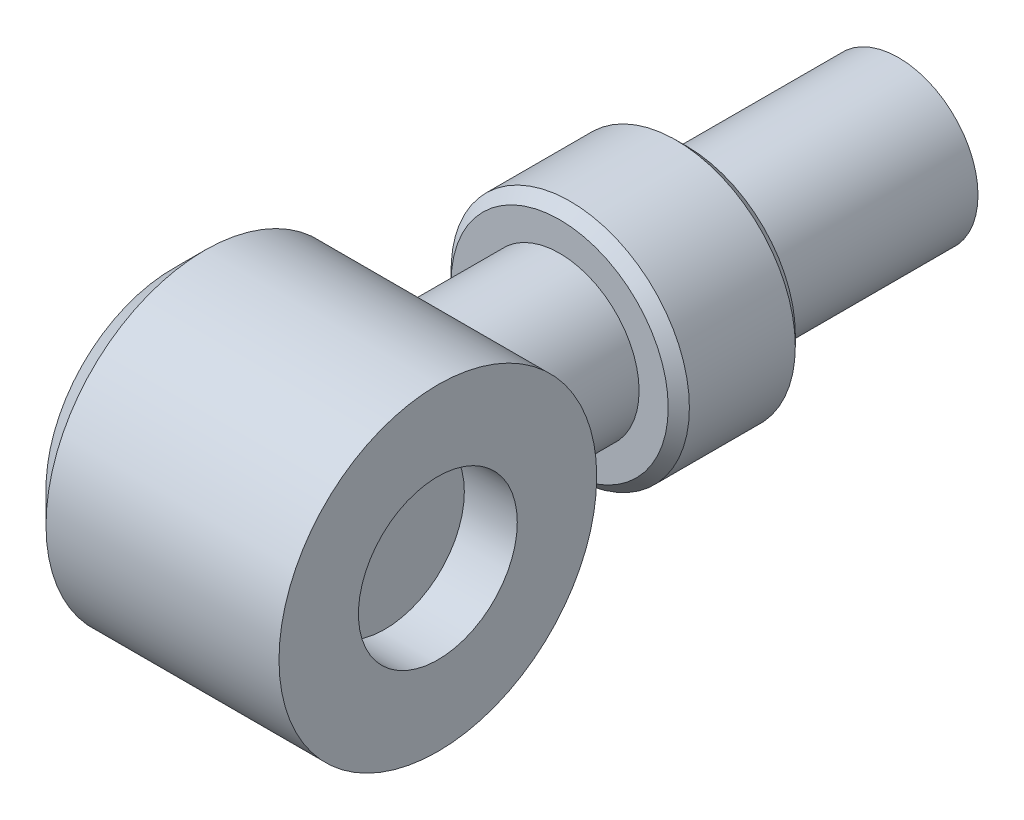
ISO-10303-21;
HEADER;
FILE_DESCRIPTION(('STEP AP214'),'2;1');
FILE_NAME('part.step','',(''),(''),'','','');
FILE_SCHEMA(('AUTOMOTIVE_DESIGN { 1 0 10303 214 1 1 1 1 }'));
ENDSEC;
DATA;
#1=APPLICATION_CONTEXT('core data for automotive mechanical design processes');
#2=APPLICATION_PROTOCOL_DEFINITION('international standard','automotive_design',2000,#1);
#3=PRODUCT_CONTEXT('',#1,'mechanical');
#4=PRODUCT('Part','Part','',(#3));
#5=PRODUCT_RELATED_PRODUCT_CATEGORY('part','',(#4));
#6=PRODUCT_DEFINITION_FORMATION('','',#4);
#7=PRODUCT_DEFINITION_CONTEXT('part definition',#1,'design');
#8=PRODUCT_DEFINITION('design','',#6,#7);
#9=PRODUCT_DEFINITION_SHAPE('','',#8);
#10=(LENGTH_UNIT() NAMED_UNIT(*) SI_UNIT(.MILLI.,.METRE.));
#11=(NAMED_UNIT(*) PLANE_ANGLE_UNIT() SI_UNIT($,.RADIAN.));
#12=(NAMED_UNIT(*) SI_UNIT($,.STERADIAN.) SOLID_ANGLE_UNIT());
#13=UNCERTAINTY_MEASURE_WITH_UNIT(LENGTH_MEASURE(1.E-05),#10,'distance_accuracy_value','');
#14=(GEOMETRIC_REPRESENTATION_CONTEXT(3) GLOBAL_UNCERTAINTY_ASSIGNED_CONTEXT((#13)) GLOBAL_UNIT_ASSIGNED_CONTEXT((#10,
#11,#12)) REPRESENTATION_CONTEXT('',''));
#15=CARTESIAN_POINT('',(0.,0.,0.));
#16=DIRECTION('',(0.,0.,1.));
#17=DIRECTION('',(1.,0.,0.));
#18=AXIS2_PLACEMENT_3D('',#15,#16,#17);
#19=CARTESIAN_POINT('',(0.,0.,12.));
#20=DIRECTION('',(0.,0.,-1.));
#21=DIRECTION('',(-1.,0.,0.));
#22=AXIS2_PLACEMENT_3D('',#19,#20,#21);
#23=CYLINDRICAL_SURFACE('',#22,22.5);
#24=CARTESIAN_POINT('',(0.,0.,-10.));
#25=DIRECTION('',(0.,0.,1.));
#26=DIRECTION('',(1.,0.,0.));
#27=AXIS2_PLACEMENT_3D('',#24,#25,#26);
#28=CIRCLE('',#27,22.5);
#29=CARTESIAN_POINT('',(22.5,0.,-10.));
#30=VERTEX_POINT('',#29);
#31=EDGE_CURVE('E43',#30,#30,#28,.T.);
#32=ORIENTED_EDGE('',*,*,#31,.T.);
#33=EDGE_LOOP('',(#32));
#34=FACE_BOUND('',#33,.T.);
#35=CARTESIAN_POINT('',(0.,0.,10.));
#36=DIRECTION('',(0.,0.,1.));
#37=DIRECTION('',(1.,0.,0.));
#38=AXIS2_PLACEMENT_3D('',#35,#36,#37);
#39=CIRCLE('',#38,22.5);
#40=CARTESIAN_POINT('',(22.5,0.,10.));
#41=VERTEX_POINT('',#40);
#42=EDGE_CURVE('E47',#41,#41,#39,.F.);
#43=ORIENTED_EDGE('',*,*,#42,.T.);
#44=EDGE_LOOP('',(#43));
#45=FACE_BOUND('',#44,.T.);
#46=ADVANCED_FACE('F32',(#34,#45),#23,.T.);
#47=CARTESIAN_POINT('',(0.,0.,12.));
#48=DIRECTION('',(0.,0.,1.));
#49=DIRECTION('',(1.,0.,0.));
#50=AXIS2_PLACEMENT_3D('',#47,#48,#49);
#51=PLANE('',#50);
#52=CARTESIAN_POINT('',(0.,0.,12.));
#53=DIRECTION('',(0.,0.,1.));
#54=DIRECTION('',(1.,0.,0.));
#55=AXIS2_PLACEMENT_3D('',#52,#53,#54);
#56=CIRCLE('',#55,20.5);
#57=CARTESIAN_POINT('',(20.5,0.,12.));
#58=VERTEX_POINT('',#57);
#59=EDGE_CURVE('E10',#58,#58,#56,.T.);
#60=ORIENTED_EDGE('',*,*,#59,.T.);
#61=EDGE_LOOP('',(#60));
#62=FACE_BOUND('',#61,.T.);
#63=CARTESIAN_POINT('',(0.,0.,12.));
#64=DIRECTION('',(0.,0.,1.));
#65=DIRECTION('',(1.,0.,0.));
#66=AXIS2_PLACEMENT_3D('',#63,#64,#65);
#67=CIRCLE('',#66,15.);
#68=CARTESIAN_POINT('',(15.,0.,12.));
#69=VERTEX_POINT('',#68);
#70=EDGE_CURVE('E72',#69,#69,#67,.T.);
#71=ORIENTED_EDGE('',*,*,#70,.F.);
#72=EDGE_LOOP('',(#71));
#73=FACE_BOUND('',#72,.T.);
#74=ADVANCED_FACE('F88',(#62,#73),#51,.T.);
#75=CARTESIAN_POINT('',(0.,0.,-12.));
#76=DIRECTION('',(0.,0.,1.));
#77=DIRECTION('',(1.,0.,0.));
#78=AXIS2_PLACEMENT_3D('',#75,#76,#77);
#79=PLANE('',#78);
#80=CARTESIAN_POINT('',(0.,0.,-12.));
#81=DIRECTION('',(0.,0.,1.));
#82=DIRECTION('',(1.,0.,0.));
#83=AXIS2_PLACEMENT_3D('',#80,#81,#82);
#84=CIRCLE('',#83,20.5);
#85=CARTESIAN_POINT('',(20.5,0.,-12.));
#86=VERTEX_POINT('',#85);
#87=EDGE_CURVE('E39',#86,#86,#84,.F.);
#88=ORIENTED_EDGE('',*,*,#87,.T.);
#89=EDGE_LOOP('',(#88));
#90=FACE_BOUND('',#89,.T.);
#91=CARTESIAN_POINT('',(0.,0.,-12.));
#92=DIRECTION('',(0.,0.,1.));
#93=DIRECTION('',(1.,0.,0.));
#94=AXIS2_PLACEMENT_3D('',#91,#92,#93);
#95=CIRCLE('',#94,15.);
#96=CARTESIAN_POINT('',(15.,0.,-12.));
#97=VERTEX_POINT('',#96);
#98=EDGE_CURVE('E58',#97,#97,#95,.F.);
#99=ORIENTED_EDGE('',*,*,#98,.F.);
#100=EDGE_LOOP('',(#99));
#101=FACE_BOUND('',#100,.T.);
#102=ADVANCED_FACE('F86',(#90,#101),#79,.F.);
#103=CARTESIAN_POINT('',(0.,0.,-52.));
#104=DIRECTION('',(0.,0.,1.));
#105=DIRECTION('',(1.,0.,0.));
#106=AXIS2_PLACEMENT_3D('',#103,#104,#105);
#107=CYLINDRICAL_SURFACE('',#106,15.);
#108=CARTESIAN_POINT('',(0.,0.,-52.));
#109=DIRECTION('',(0.,0.,-1.));
#110=DIRECTION('',(-1.,0.,0.));
#111=AXIS2_PLACEMENT_3D('',#108,#109,#110);
#112=CIRCLE('',#111,15.);
#113=CARTESIAN_POINT('',(-15.,0.,-52.));
#114=VERTEX_POINT('',#113);
#115=EDGE_CURVE('E61',#114,#114,#112,.T.);
#116=ORIENTED_EDGE('',*,*,#115,.F.);
#117=EDGE_LOOP('',(#116));
#118=FACE_BOUND('',#117,.T.);
#119=ORIENTED_EDGE('',*,*,#98,.T.);
#120=EDGE_LOOP('',(#119));
#121=FACE_BOUND('',#120,.T.);
#122=ADVANCED_FACE('F82',(#118,#121),#107,.T.);
#123=CARTESIAN_POINT('',(0.,0.,-52.));
#124=DIRECTION('',(0.,0.,-1.));
#125=DIRECTION('',(-1.,0.,0.));
#126=AXIS2_PLACEMENT_3D('',#123,#124,#125);
#127=PLANE('',#126);
#128=ORIENTED_EDGE('',*,*,#115,.T.);
#129=EDGE_LOOP('',(#128));
#130=FACE_BOUND('',#129,.T.);
#131=ADVANCED_FACE('F79',(#130),#127,.T.);
#132=CARTESIAN_POINT('',(0.,0.,500000.));
#133=DIRECTION('',(0.,0.,-1.));
#134=DIRECTION('',(-1.,0.,0.));
#135=AXIS2_PLACEMENT_3D('',#132,#133,#134);
#136=CYLINDRICAL_SURFACE('',#135,15.);
#137=ORIENTED_EDGE('',*,*,#70,.T.);
#138=EDGE_LOOP('',(#137));
#139=FACE_BOUND('',#138,.T.);
#140=CARTESIAN_POINT('',(-15.,0.,30.0000000000023));
#141=CARTESIAN_POINT('',(-14.9999986967893,-0.394466621474841,30.0000011984455));
#142=CARTESIAN_POINT('',(-14.9844217290986,-0.788960822893733,30.0077983744419));
#143=CARTESIAN_POINT('',(-14.9222912626951,-1.57504384672509,30.0387906968739));
#144=CARTESIAN_POINT('',(-14.8757242881962,-1.96663133023585,30.0619925419109));
#145=CARTESIAN_POINT('',(-14.752062134402,-2.74444839066614,30.1232456655127));
#146=CARTESIAN_POINT('',(-14.6749156717779,-3.13066783309061,30.1613218875906));
#147=CARTESIAN_POINT('',(-14.4909926788045,-3.89427274204158,30.2513454827882));
#148=CARTESIAN_POINT('',(-14.3842191117728,-4.27165908796747,30.3032914686275));
#149=CARTESIAN_POINT('',(-14.1426464967422,-5.01370255233923,30.4195454648338));
#150=CARTESIAN_POINT('',(-14.0079586988167,-5.37840368544467,30.4838043286831));
#151=CARTESIAN_POINT('',(-13.7115835174738,-6.09447648128189,30.6233011875056));
#152=CARTESIAN_POINT('',(-13.5498955527414,-6.44584785682347,30.6985394188606));
#153=CARTESIAN_POINT('',(-13.2009461452605,-7.13327098283047,30.8582613908768));
#154=CARTESIAN_POINT('',(-13.0136941461367,-7.46932832959938,30.9427417151322));
#155=CARTESIAN_POINT('',(-12.6148696065897,-8.12479620523728,31.1191595930147));
#156=CARTESIAN_POINT('',(-12.4032874777651,-8.44420009848118,31.2111000824307));
#157=CARTESIAN_POINT('',(-11.9437431549206,-9.08356730455522,31.4061694854223));
#158=CARTESIAN_POINT('',(-11.6943566948692,-9.40240338911212,31.5096387559583));
#159=CARTESIAN_POINT('',(-11.1713323045256,-10.0182110858625,31.7203010589421));
#160=CARTESIAN_POINT('',(-10.8976929878611,-10.3151814463613,31.8274943040511));
#161=CARTESIAN_POINT('',(-10.3274421322098,-10.8860835918353,32.0431340534047));
#162=CARTESIAN_POINT('',(-10.0308163772595,-11.1600008976789,32.1515812973432));
#163=CARTESIAN_POINT('',(-9.41609706949237,-11.6833254232376,32.3670484725743));
#164=CARTESIAN_POINT('',(-9.09799950074778,-11.9327280363633,32.4740681323546));
#165=CARTESIAN_POINT('',(-8.41621019135638,-12.4240666663251,32.6921196878575));
#166=CARTESIAN_POINT('',(-8.05089693128145,-12.6639084928375,32.8028149530864));
#167=CARTESIAN_POINT('',(-7.29906225682766,-13.1116371457318,33.0158114298701));
#168=CARTESIAN_POINT('',(-6.91254992484969,-13.319537514021,33.1181161900414));
#169=CARTESIAN_POINT('',(-6.1204511952892,-13.7015816677249,33.3108177560533));
#170=CARTESIAN_POINT('',(-5.71487061752177,-13.8757356708104,33.4012181636103));
#171=CARTESIAN_POINT('',(-4.88717106989463,-14.1884178363296,33.5666850653911));
#172=CARTESIAN_POINT('',(-4.46505393858188,-14.3269499463524,33.6417532585286));
#173=CARTESIAN_POINT('',(-3.63312743966071,-14.5593818816457,33.7694656361183));
#174=CARTESIAN_POINT('',(-3.22409061692188,-14.6554546162324,33.8231819916719));
#175=CARTESIAN_POINT('',(-2.39742530260402,-14.8131483158836,33.9120933725818));
#176=CARTESIAN_POINT('',(-1.9797971793402,-14.874770754679,33.9472891902146));
#177=CARTESIAN_POINT('',(-1.13997809784112,-14.9625716596024,33.9976150205557));
#178=CARTESIAN_POINT('',(-0.717791304375684,-14.9887801055065,34.0127620054154));
#179=CARTESIAN_POINT('',(0.127503752153367,-15.0054120092055,34.0223610149371));
#180=CARTESIAN_POINT('',(0.550611923450999,-14.9958388811994,34.0168150140783));
#181=CARTESIAN_POINT('',(1.34318604493272,-14.9443693637688,33.9871854699879));
#182=CARTESIAN_POINT('',(1.71300749674357,-14.9064815133301,33.9654016426218));
#183=CARTESIAN_POINT('',(2.44761394651902,-14.8036048078167,33.9067672995302));
#184=CARTESIAN_POINT('',(2.81239941379478,-14.7386184959445,33.8699181976935));
#185=CARTESIAN_POINT('',(3.53465011425951,-14.5822778462236,33.7823498774175));
#186=CARTESIAN_POINT('',(3.89211348946956,-14.4909169024539,33.7316271842972));
#187=CARTESIAN_POINT('',(4.59755097022426,-14.2827793732035,33.6178799154345));
#188=CARTESIAN_POINT('',(4.94552456919422,-14.1660014339124,33.5548546844284));
#189=CARTESIAN_POINT('',(5.63806138553543,-13.9051185945144,33.4167356572684));
#190=CARTESIAN_POINT('',(5.98236177926333,-13.7604466030274,33.3413974796238));
#191=CARTESIAN_POINT('',(6.6576488128704,-13.4467240006948,33.1817863498032));
#192=CARTESIAN_POINT('',(6.98863063670941,-13.2776646708394,33.097510204973));
#193=CARTESIAN_POINT('',(7.6358395411983,-12.916320746071,32.9221681212191));
#194=CARTESIAN_POINT('',(7.95206429387378,-12.7240325037788,32.8311011168632));
#195=CARTESIAN_POINT('',(8.5685227561537,-12.3173373374605,32.6443191371437));
#196=CARTESIAN_POINT('',(8.8687551800777,-12.1029286391492,32.5486037892621));
#197=CARTESIAN_POINT('',(9.48921356105565,-11.6244221009994,32.3422881545745));
#198=CARTESIAN_POINT('',(9.80713018813423,-11.3574724540829,32.2313422891799));
#199=CARTESIAN_POINT('',(10.4195910602955,-10.7983337273757,32.0091719486512));
#200=CARTESIAN_POINT('',(10.7141433900477,-10.5061534517947,31.8979475837492));
#201=CARTESIAN_POINT('',(11.2787205781468,-9.89761910582885,31.6778903447877));
#202=CARTESIAN_POINT('',(11.5487236024524,-9.58124396820893,31.5690596636207));
#203=CARTESIAN_POINT('',(12.0621805278787,-8.92619254193703,31.3566484542524));
#204=CARTESIAN_POINT('',(12.3056450163624,-8.58752523371352,31.2530658412628));
#205=CARTESIAN_POINT('',(12.7751937974682,-7.8730915238493,31.0490279507982));
#206=CARTESIAN_POINT('',(12.9999312688771,-7.49633062281147,30.9489459616295));
#207=CARTESIAN_POINT('',(13.4165538554256,-6.72229496746207,30.7601397693207));
#208=CARTESIAN_POINT('',(13.6084374406831,-6.32501925897356,30.6714160951431));
#209=CARTESIAN_POINT('',(13.95719145457,-5.51289034160726,30.507976152198));
#210=CARTESIAN_POINT('',(14.1140841452216,-5.09804850978503,30.4332509821276));
#211=CARTESIAN_POINT('',(14.3910761684711,-4.25373396764085,30.3000284698657));
#212=CARTESIAN_POINT('',(14.5111797336915,-3.82426294674293,30.2415292609357));
#213=CARTESIAN_POINT('',(14.7045987917793,-2.99040123124769,30.1467130246424));
#214=CARTESIAN_POINT('',(14.7809658647281,-2.58687987737163,30.1089599379182));
#215=CARTESIAN_POINT('',(14.9004227368483,-1.77375891598874,30.0497096179865));
#216=CARTESIAN_POINT('',(14.9435143460633,-1.36415964033046,30.0282115005791));
#217=CARTESIAN_POINT('',(14.9958394822899,-0.542432179601423,30.002088586177));
#218=CARTESIAN_POINT('',(15.0050865466642,-0.130305071716841,29.9974570427833));
#219=CARTESIAN_POINT('',(14.9896332143828,0.693142933067965,30.005182902425));
#220=CARTESIAN_POINT('',(14.9649343201033,1.10446386484103,30.0175395535989));
#221=CARTESIAN_POINT('',(14.8851569218173,1.89104365716484,30.0572742996872));
#222=CARTESIAN_POINT('',(14.8325856924446,2.26662317638432,30.0834117840358));
#223=CARTESIAN_POINT('',(14.6994449555598,3.01155508954012,30.1491988284816));
#224=CARTESIAN_POINT('',(14.618877249521,3.38090788254105,30.1888475191776));
#225=CARTESIAN_POINT('',(14.4305792041858,4.11102643115725,30.2807323556061));
#226=CARTESIAN_POINT('',(14.322847354219,4.47179170797634,30.3329692013922));
#227=CARTESIAN_POINT('',(14.0812572947495,5.18257720416908,30.4488481102626));
#228=CARTESIAN_POINT('',(13.9473979874992,5.53259697135373,30.5124906525492));
#229=CARTESIAN_POINT('',(13.6505393721981,6.22979935488028,30.6517537822062));
#230=CARTESIAN_POINT('',(13.4868176517072,6.57661612017314,30.727664302393));
#231=CARTESIAN_POINT('',(13.1343016754681,7.2550868034974,30.8883996001503));
#232=CARTESIAN_POINT('',(12.9455071994248,7.58674058826894,30.9732244560427));
#233=CARTESIAN_POINT('',(12.5441531585985,8.23341158684502,31.1499858507572));
#234=CARTESIAN_POINT('',(12.3315897999931,8.54842613296254,31.2419235241537));
#235=CARTESIAN_POINT('',(11.8839483671782,9.16054648853298,31.4310122851658));
#236=CARTESIAN_POINT('',(11.6488615394066,9.45764526147828,31.5281653932149));
#237=CARTESIAN_POINT('',(11.1333715012892,10.0608391073351,31.7353414642011));
#238=CARTESIAN_POINT('',(10.8507851186194,10.3649587307602,31.8456921439829));
#239=CARTESIAN_POINT('',(10.2616154855623,10.9485707923033,32.0674692994105));
#240=CARTESIAN_POINT('',(9.95503116977244,11.2280621358617,32.1788958226263));
#241=CARTESIAN_POINT('',(9.31919419442981,11.7611578740021,32.4000272898316));
#242=CARTESIAN_POINT('',(8.9899279270946,12.0147464980316,32.5097311510101));
#243=CARTESIAN_POINT('',(8.31037887445751,12.4944228999318,32.7243979489938));
#244=CARTESIAN_POINT('',(7.96009249191935,12.7205059505333,32.8293600689122));
#245=CARTESIAN_POINT('',(7.22261605950768,13.153917206094,33.0364145372086));
#246=CARTESIAN_POINT('',(6.83445930863611,13.3597919511092,33.1381169374886));
#247=CARTESIAN_POINT('',(6.0392785059831,13.7375672329611,33.3293403874839));
#248=CARTESIAN_POINT('',(5.63226376216383,13.909484314717,33.4188673626777));
#249=CARTESIAN_POINT('',(4.80217565091463,14.2174151642658,33.5822880682726));
#250=CARTESIAN_POINT('',(4.37911544662168,14.353457663537,33.656194299646));
#251=CARTESIAN_POINT('',(3.51992505793503,14.5879514095296,33.7853159874805));
#252=CARTESIAN_POINT('',(3.08379690851359,14.6864084766722,33.8405343377673));
#253=CARTESIAN_POINT('',(2.24471283239224,14.8366134509912,33.9254608695714));
#254=CARTESIAN_POINT('',(1.84259137531843,14.8919378625023,33.9571090305878));
#255=CARTESIAN_POINT('',(1.03415900372192,14.9698153891526,34.0017947783997));
#256=CARTESIAN_POINT('',(0.627848376009248,14.9923707330054,34.0148336308638));
#257=CARTESIAN_POINT('',(-0.185270351508141,15.0043645010929,34.0217573653192));
#258=CARTESIAN_POINT('',(-0.592078211651319,14.9938151743778,34.0156493318453));
#259=CARTESIAN_POINT('',(-1.40275816467987,14.939788481599,33.9845490123115));
#260=CARTESIAN_POINT('',(-1.80663037706597,14.8963124635393,33.9595574993326));
#261=CARTESIAN_POINT('',(-2.56967168244075,14.782795841076,33.8949672789861));
#262=CARTESIAN_POINT('',(-2.92942204471833,14.7156934571527,33.8569941501007));
#263=CARTESIAN_POINT('',(-3.64159381579544,14.5558242789107,33.7676466677042));
#264=CARTESIAN_POINT('',(-3.99401275857409,14.4630489945772,33.7162678812707));
#265=CARTESIAN_POINT('',(-4.68939648000375,14.2527724980854,33.6016517113839));
#266=CARTESIAN_POINT('',(-5.03236114606193,14.1352709916015,33.5384141867725));
#267=CARTESIAN_POINT('',(-5.70716431681714,13.8765585244576,33.4018326364665));
#268=CARTESIAN_POINT('',(-6.03900172289264,13.7353452308955,33.3284876164657));
#269=CARTESIAN_POINT('',(-6.71194905721821,13.4200195538921,33.1683695444201));
#270=CARTESIAN_POINT('',(-7.052186337383,13.2443351386714,33.0810256229154));
#271=CARTESIAN_POINT('',(-7.71683729888781,12.8684192321827,32.8993107427324));
#272=CARTESIAN_POINT('',(-8.04125049766923,12.6681869929772,32.804939569978));
#273=CARTESIAN_POINT('',(-8.67307599887733,12.2442855818537,32.6114666475547));
#274=CARTESIAN_POINT('',(-8.98048183592655,12.0206075892617,32.5123631251881));
#275=CARTESIAN_POINT('',(-9.57700095794109,11.5509819278366,32.3117348192738));
#276=CARTESIAN_POINT('',(-9.86611149224969,11.3050309237572,32.2102096747853));
#277=CARTESIAN_POINT('',(-10.4588881043878,10.7607009160987,31.9945880165764));
#278=CARTESIAN_POINT('',(-10.7600384098887,10.4595848725633,31.8804663758213));
#279=CARTESIAN_POINT('',(-11.3360350079753,9.83237263592971,31.6550628439847));
#280=CARTESIAN_POINT('',(-11.6108894699082,9.50628425805786,31.5437800788784));
#281=CARTESIAN_POINT('',(-12.1328673274453,8.83040064495077,31.3268405545289));
#282=CARTESIAN_POINT('',(-12.37996865132,8.48058689086171,31.2211883077679));
#283=CARTESIAN_POINT('',(-12.8443186951048,7.75934315416588,31.0184042132714));
#284=CARTESIAN_POINT('',(-13.0615691351247,7.38791441884522,30.9212718747065));
#285=CARTESIAN_POINT('',(-13.4657554418475,6.62283359834567,30.737499586337));
#286=CARTESIAN_POINT('',(-13.6524633074691,6.22904153096534,30.650939674485));
#287=CARTESIAN_POINT('',(-13.9917304392216,5.42422205013347,30.4915931025656));
#288=CARTESIAN_POINT('',(-14.1442848128174,5.01319217734285,30.418808416049));
#289=CARTESIAN_POINT('',(-14.4130312534336,4.17809175418113,30.2893683631609));
#290=CARTESIAN_POINT('',(-14.52931393542,3.75405665560539,30.2326728349316));
#291=CARTESIAN_POINT('',(-14.7244141315277,2.89570983328129,30.136960690795));
#292=CARTESIAN_POINT('',(-14.8032545313493,2.46140455781236,30.0979332763591));
#293=CARTESIAN_POINT('',(-14.9084233559045,1.68912528485795,30.0457085005696));
#294=CARTESIAN_POINT('',(-14.9427351996439,1.35247752005859,30.0285977869552));
#295=CARTESIAN_POINT('',(-14.9885243961843,0.67722664727998,30.0057428654134));
#296=CARTESIAN_POINT('',(-15.0000011187201,0.338623485589102,29.9999989712181));
#297=CARTESIAN_POINT('',(-15.,0.,30.0000000000023));
#298=B_SPLINE_CURVE_WITH_KNOTS('',3,(#140,#141,#142,#143,#144,#145,#146,#147,#148,#149,#150,
#151,#152,#153,#154,#155,#156,#157,#158,#159,#160,#161,#162,#163,#164,#165,#166,#167,#168,#169,
#170,#171,#172,#173,#174,#175,#176,#177,#178,#179,#180,#181,#182,#183,#184,#185,#186,#187,#188,
#189,#190,#191,#192,#193,#194,#195,#196,#197,#198,#199,#200,#201,#202,#203,#204,#205,#206,#207,
#208,#209,#210,#211,#212,#213,#214,#215,#216,#217,#218,#219,#220,#221,#222,#223,#224,#225,#226,
#227,#228,#229,#230,#231,#232,#233,#234,#235,#236,#237,#238,#239,#240,#241,#242,#243,#244,#245,
#246,#247,#248,#249,#250,#251,#252,#253,#254,#255,#256,#257,#258,#259,#260,#261,#262,#263,#264,
#265,#266,#267,#268,#269,#270,#271,#272,#273,#274,#275,#276,#277,#278,#279,#280,#281,#282,#283,
#284,#285,#286,#287,#288,#289,#290,#291,#292,#293,#294,#295,#296,#297),.UNSPECIFIED.,.T.,.F.,(4,
2,2,2,2,2,2,2,2,2,2,2,2,2,2,2,2,2,2,2,2,2,2,2,2,2,2,2,2,2,2,2,2,2,2,2,2,2,2,2,2,2,2,2,2,2,2,2,2,
2,2,2,2,2,2,2,2,2,2,2,2,2,2,2,2,2,2,2,2,2,2,2,2,2,2,2,2,2,4),(0.,1.18306588387664,
2.36664655205944,3.55222059958426,4.73767610811702,5.91849492154767,7.09933916134025,
8.2797483592022,9.46062435602742,10.7126941080734,11.9648354787243,13.2177575130877,
14.4709145374424,15.8216672017212,17.1718456109056,18.5216145742372,19.8712338927468,
21.1401798733573,22.4090715662492,23.6768884023225,24.9445842691986,26.0604534443429,
27.1762179182404,28.2922620948531,29.4083657309786,30.5501573825652,31.6923582661889,
32.8347387306654,33.9772108970054,35.2649000045825,36.5521415758275,37.8405170382694,
39.1283766165389,40.4765138704577,41.8247138850021,43.1720536807211,44.5192384054882,
45.7548292237564,46.9903528264141,48.2253821822108,49.4603568799795,50.599458337191,
51.7384865108586,52.8775780428888,54.0167174442703,55.1883567290372,56.3600063087794,
57.5318431666802,58.7041373111918,59.9914055352967,61.278730940896,62.5668355046823,
63.8551611378708,65.2063513889895,66.5568816778177,67.9063270370396,69.2555633384071,
70.4752824018565,71.6949185050054,72.9141033841499,74.1332383531128,75.2357784731187,
76.3386836391978,77.4416019343194,78.544628804535,79.721692743701,80.8987925552605,
82.0763368112876,83.2540576898125,84.5752168212049,85.8959641652361,87.2177545550282,
88.5394687467833,89.8706389488178,91.2019997209941,92.5300073067731,93.8572021316089,
94.872757858524,95.8883416150965),.UNSPECIFIED.);
#299=CARTESIAN_POINT('',(-15.,0.,30.0000000000023));
#300=VERTEX_POINT('',#299);
#301=EDGE_CURVE('E64',#300,#300,#298,.T.);
#302=ORIENTED_EDGE('',*,*,#301,.F.);
#303=EDGE_LOOP('',(#302));
#304=FACE_BOUND('',#303,.T.);
#305=ADVANCED_FACE('F74',(#139,#304),#136,.T.);
#306=CARTESIAN_POINT('',(25.,0.,60.));
#307=DIRECTION('',(-1.,0.,0.));
#308=DIRECTION('',(0.,0.,1.));
#309=AXIS2_PLACEMENT_3D('',#306,#307,#308);
#310=CYLINDRICAL_SURFACE('',#309,30.);
#311=CARTESIAN_POINT('',(-19.,0.,60.));
#312=DIRECTION('',(1.,0.,0.));
#313=DIRECTION('',(0.,0.,-1.));
#314=AXIS2_PLACEMENT_3D('',#311,#312,#313);
#315=CIRCLE('',#314,30.);
#316=CARTESIAN_POINT('',(-19.,0.,30.));
#317=VERTEX_POINT('',#316);
#318=EDGE_CURVE('E55',#317,#317,#315,.T.);
#319=ORIENTED_EDGE('',*,*,#318,.T.);
#320=EDGE_LOOP('',(#319));
#321=FACE_BOUND('',#320,.T.);
#322=CARTESIAN_POINT('',(25.,0.,60.));
#323=DIRECTION('',(1.,0.,0.));
#324=DIRECTION('',(0.,0.,-1.));
#325=AXIS2_PLACEMENT_3D('',#322,#323,#324);
#326=CIRCLE('',#325,30.);
#327=CARTESIAN_POINT('',(25.,0.,30.));
#328=VERTEX_POINT('',#327);
#329=EDGE_CURVE('E145',#328,#328,#326,.T.);
#330=ORIENTED_EDGE('',*,*,#329,.F.);
#331=EDGE_LOOP('',(#330));
#332=FACE_BOUND('',#331,.T.);
#333=ORIENTED_EDGE('',*,*,#301,.T.);
#334=EDGE_LOOP('',(#333));
#335=FACE_BOUND('',#334,.T.);
#336=ADVANCED_FACE('F130',(#321,#332,#335),#310,.T.);
#337=CARTESIAN_POINT('',(25.,0.,60.));
#338=DIRECTION('',(1.,0.,0.));
#339=DIRECTION('',(0.,0.,-1.));
#340=AXIS2_PLACEMENT_3D('',#337,#338,#339);
#341=PLANE('',#340);
#342=CARTESIAN_POINT('',(25.,0.,60.));
#343=DIRECTION('',(1.,0.,0.));
#344=DIRECTION('',(0.,0.,-1.));
#345=AXIS2_PLACEMENT_3D('',#342,#343,#344);
#346=CIRCLE('',#345,15.);
#347=CARTESIAN_POINT('',(25.,0.,45.));
#348=VERTEX_POINT('',#347);
#349=EDGE_CURVE('E152',#348,#348,#346,.T.);
#350=ORIENTED_EDGE('',*,*,#349,.F.);
#351=EDGE_LOOP('',(#350));
#352=FACE_BOUND('',#351,.T.);
#353=ORIENTED_EDGE('',*,*,#329,.T.);
#354=EDGE_LOOP('',(#353));
#355=FACE_BOUND('',#354,.T.);
#356=ADVANCED_FACE('F127',(#352,#355),#341,.T.);
#357=CARTESIAN_POINT('',(-25.,0.,60.));
#358=DIRECTION('',(1.,0.,0.));
#359=DIRECTION('',(0.,0.,-1.));
#360=AXIS2_PLACEMENT_3D('',#357,#358,#359);
#361=PLANE('',#360);
#362=CARTESIAN_POINT('',(-25.,0.,60.));
#363=DIRECTION('',(1.,0.,0.));
#364=DIRECTION('',(0.,0.,-1.));
#365=AXIS2_PLACEMENT_3D('',#362,#363,#364);
#366=CIRCLE('',#365,24.);
#367=CARTESIAN_POINT('',(-25.,0.,36.));
#368=VERTEX_POINT('',#367);
#369=EDGE_CURVE('E52',#368,#368,#366,.F.);
#370=ORIENTED_EDGE('',*,*,#369,.T.);
#371=EDGE_LOOP('',(#370));
#372=FACE_BOUND('',#371,.T.);
#373=ADVANCED_FACE('F99',(#372),#361,.F.);
#374=CARTESIAN_POINT('',(-19.,0.,60.));
#375=DIRECTION('',(1.,0.,0.));
#376=DIRECTION('',(0.,0.,-1.));
#377=AXIS2_PLACEMENT_3D('',#374,#375,#376);
#378=CONICAL_SURFACE('',#377,30.,0.785398163397452);
#379=ORIENTED_EDGE('',*,*,#369,.F.);
#380=EDGE_LOOP('',(#379));
#381=FACE_BOUND('',#380,.T.);
#382=ORIENTED_EDGE('',*,*,#318,.F.);
#383=EDGE_LOOP('',(#382));
#384=FACE_BOUND('',#383,.T.);
#385=ADVANCED_FACE('F96',(#381,#384),#378,.T.);
#386=CARTESIAN_POINT('',(0.,0.,-10.));
#387=DIRECTION('',(0.,0.,1.));
#388=DIRECTION('',(1.,0.,0.));
#389=AXIS2_PLACEMENT_3D('',#386,#387,#388);
#390=CONICAL_SURFACE('',#389,22.5,0.785398163397455);
#391=ORIENTED_EDGE('',*,*,#87,.F.);
#392=EDGE_LOOP('',(#391));
#393=FACE_BOUND('',#392,.T.);
#394=ORIENTED_EDGE('',*,*,#31,.F.);
#395=EDGE_LOOP('',(#394));
#396=FACE_BOUND('',#395,.T.);
#397=ADVANCED_FACE('F98',(#393,#396),#390,.T.);
#398=CARTESIAN_POINT('',(0.,0.,12.));
#399=DIRECTION('',(0.,0.,-1.));
#400=DIRECTION('',(-1.,0.,0.));
#401=AXIS2_PLACEMENT_3D('',#398,#399,#400);
#402=CONICAL_SURFACE('',#401,20.5,0.785398163397449);
#403=ORIENTED_EDGE('',*,*,#42,.F.);
#404=EDGE_LOOP('',(#403));
#405=FACE_BOUND('',#404,.T.);
#406=ORIENTED_EDGE('',*,*,#59,.F.);
#407=EDGE_LOOP('',(#406));
#408=FACE_BOUND('',#407,.T.);
#409=ADVANCED_FACE('F34',(#405,#408),#402,.T.);
#410=CARTESIAN_POINT('',(15.,0.,60.));
#411=DIRECTION('',(1.,0.,0.));
#412=DIRECTION('',(0.,0.,-1.));
#413=AXIS2_PLACEMENT_3D('',#410,#411,#412);
#414=CYLINDRICAL_SURFACE('',#413,15.);
#415=CARTESIAN_POINT('',(15.,0.,60.));
#416=DIRECTION('',(1.,0.,0.));
#417=DIRECTION('',(0.,0.,-1.));
#418=AXIS2_PLACEMENT_3D('',#415,#416,#417);
#419=CIRCLE('',#418,15.);
#420=CARTESIAN_POINT('',(15.,0.,45.));
#421=VERTEX_POINT('',#420);
#422=EDGE_CURVE('E149',#421,#421,#419,.T.);
#423=ORIENTED_EDGE('',*,*,#422,.F.);
#424=EDGE_LOOP('',(#423));
#425=FACE_BOUND('',#424,.T.);
#426=ORIENTED_EDGE('',*,*,#349,.T.);
#427=EDGE_LOOP('',(#426));
#428=FACE_BOUND('',#427,.T.);
#429=ADVANCED_FACE('F106',(#425,#428),#414,.F.);
#430=CARTESIAN_POINT('',(15.,0.,60.));
#431=DIRECTION('',(1.,0.,0.));
#432=DIRECTION('',(0.,0.,-1.));
#433=AXIS2_PLACEMENT_3D('',#430,#431,#432);
#434=PLANE('',#433);
#435=ORIENTED_EDGE('',*,*,#422,.T.);
#436=EDGE_LOOP('',(#435));
#437=FACE_BOUND('',#436,.T.);
#438=ADVANCED_FACE('F116',(#437),#434,.T.);
#439=CLOSED_SHELL('',(#46,#74,#102,#122,#131,#305,#336,#356,#373,#385,#397,#409,#429,#438));
#440=MANIFOLD_SOLID_BREP('B2',#439);
#441=ADVANCED_BREP_SHAPE_REPRESENTATION('',(#18,#440),#14);
#442=SHAPE_DEFINITION_REPRESENTATION(#9,#441);
ENDSEC;
END-ISO-10303-21;
